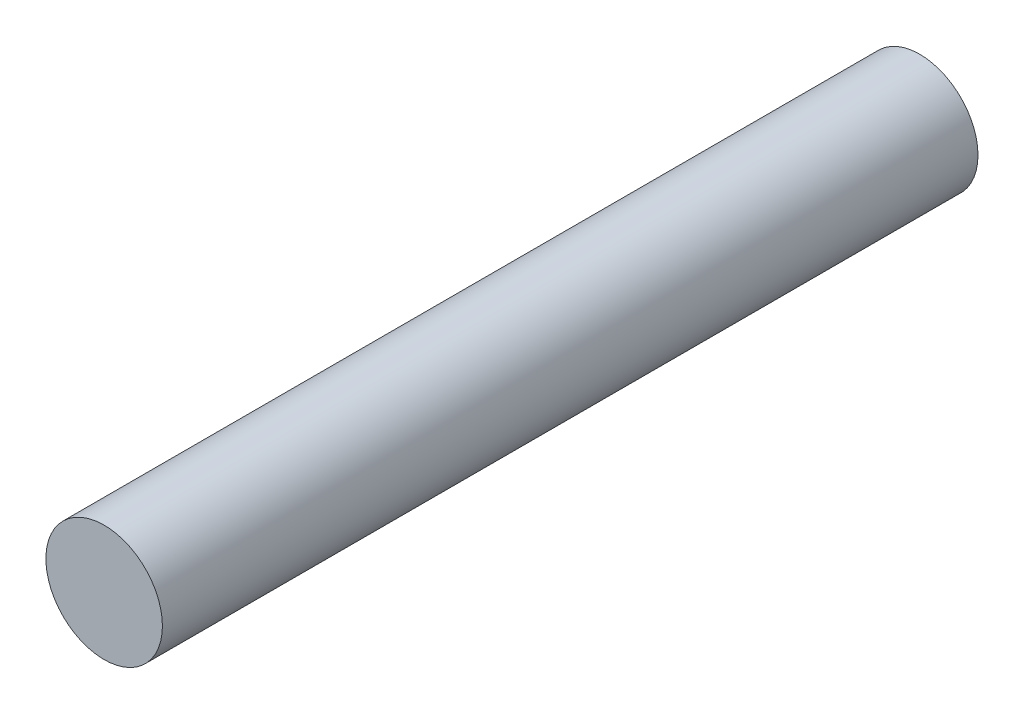
ISO-10303-21;
HEADER;
FILE_DESCRIPTION(('STEP AP214'),'2;1');
FILE_NAME('part.step','',(''),(''),'','','');
FILE_SCHEMA(('AUTOMOTIVE_DESIGN { 1 0 10303 214 1 1 1 1 }'));
ENDSEC;
DATA;
#1=APPLICATION_CONTEXT('core data for automotive mechanical design processes');
#2=APPLICATION_PROTOCOL_DEFINITION('international standard','automotive_design',2000,#1);
#3=PRODUCT_CONTEXT('',#1,'mechanical');
#4=PRODUCT('Part','Part','',(#3));
#5=PRODUCT_RELATED_PRODUCT_CATEGORY('part','',(#4));
#6=PRODUCT_DEFINITION_FORMATION('','',#4);
#7=PRODUCT_DEFINITION_CONTEXT('part definition',#1,'design');
#8=PRODUCT_DEFINITION('design','',#6,#7);
#9=PRODUCT_DEFINITION_SHAPE('','',#8);
#10=(LENGTH_UNIT() NAMED_UNIT(*) SI_UNIT(.MILLI.,.METRE.));
#11=(NAMED_UNIT(*) PLANE_ANGLE_UNIT() SI_UNIT($,.RADIAN.));
#12=(NAMED_UNIT(*) SI_UNIT($,.STERADIAN.) SOLID_ANGLE_UNIT());
#13=UNCERTAINTY_MEASURE_WITH_UNIT(LENGTH_MEASURE(1.E-05),#10,'distance_accuracy_value','');
#14=(GEOMETRIC_REPRESENTATION_CONTEXT(3) GLOBAL_UNCERTAINTY_ASSIGNED_CONTEXT((#13)) GLOBAL_UNIT_ASSIGNED_CONTEXT((#10,
#11,#12)) REPRESENTATION_CONTEXT('',''));
#15=CARTESIAN_POINT('',(0.,0.,0.));
#16=DIRECTION('',(0.,0.,1.));
#17=DIRECTION('',(1.,0.,0.));
#18=AXIS2_PLACEMENT_3D('',#15,#16,#17);
#19=CARTESIAN_POINT('',(0.,0.,28.));
#20=DIRECTION('',(0.,0.,-1.));
#21=DIRECTION('',(-1.,0.,0.));
#22=AXIS2_PLACEMENT_3D('',#19,#20,#21);
#23=CYLINDRICAL_SURFACE('',#22,2.);
#24=CARTESIAN_POINT('',(0.,0.,28.));
#25=DIRECTION('',(0.,0.,1.));
#26=DIRECTION('',(1.,0.,0.));
#27=AXIS2_PLACEMENT_3D('',#24,#25,#26);
#28=CIRCLE('',#27,2.);
#29=CARTESIAN_POINT('',(2.,0.,28.));
#30=VERTEX_POINT('',#29);
#31=EDGE_CURVE('E10',#30,#30,#28,.T.);
#32=ORIENTED_EDGE('',*,*,#31,.F.);
#33=EDGE_LOOP('',(#32));
#34=FACE_BOUND('',#33,.T.);
#35=CARTESIAN_POINT('',(0.,0.,0.));
#36=DIRECTION('',(0.,0.,1.));
#37=DIRECTION('',(1.,0.,0.));
#38=AXIS2_PLACEMENT_3D('',#35,#36,#37);
#39=CIRCLE('',#38,2.);
#40=CARTESIAN_POINT('',(2.,0.,0.));
#41=VERTEX_POINT('',#40);
#42=EDGE_CURVE('E44',#41,#41,#39,.T.);
#43=ORIENTED_EDGE('',*,*,#42,.T.);
#44=EDGE_LOOP('',(#43));
#45=FACE_BOUND('',#44,.T.);
#46=ADVANCED_FACE('F41',(#34,#45),#23,.T.);
#47=CARTESIAN_POINT('',(0.,0.,28.));
#48=DIRECTION('',(0.,0.,1.));
#49=DIRECTION('',(1.,0.,0.));
#50=AXIS2_PLACEMENT_3D('',#47,#48,#49);
#51=PLANE('',#50);
#52=ORIENTED_EDGE('',*,*,#31,.T.);
#53=EDGE_LOOP('',(#52));
#54=FACE_BOUND('',#53,.T.);
#55=ADVANCED_FACE('F58',(#54),#51,.T.);
#56=CARTESIAN_POINT('',(0.,0.,0.));
#57=DIRECTION('',(0.,0.,1.));
#58=DIRECTION('',(1.,0.,0.));
#59=AXIS2_PLACEMENT_3D('',#56,#57,#58);
#60=PLANE('',#59);
#61=ORIENTED_EDGE('',*,*,#42,.F.);
#62=EDGE_LOOP('',(#61));
#63=FACE_BOUND('',#62,.T.);
#64=ADVANCED_FACE('F56',(#63),#60,.F.);
#65=CLOSED_SHELL('',(#46,#55,#64));
#66=MANIFOLD_SOLID_BREP('B2',#65);
#67=ADVANCED_BREP_SHAPE_REPRESENTATION('',(#18,#66),#14);
#68=SHAPE_DEFINITION_REPRESENTATION(#9,#67);
ENDSEC;
END-ISO-10303-21;
